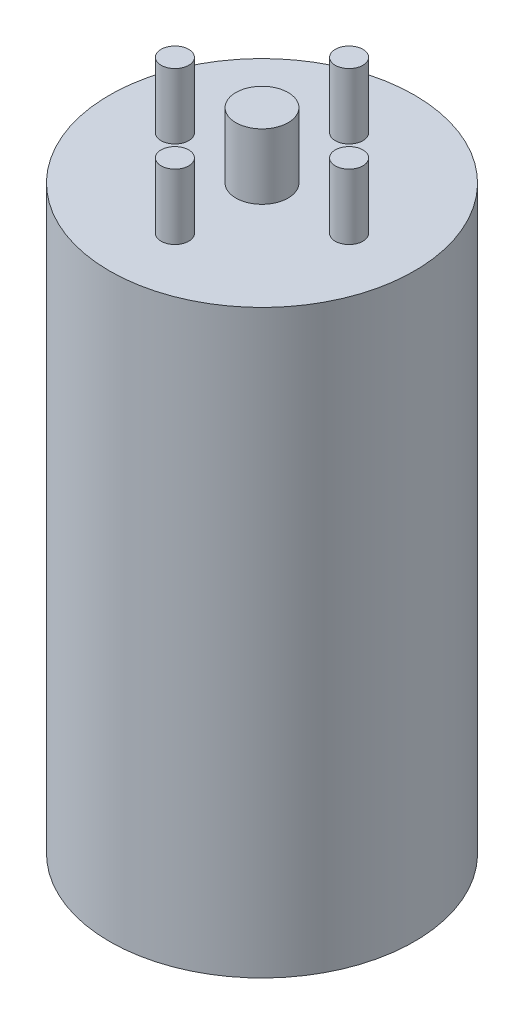
ISO-10303-21;
HEADER;
FILE_DESCRIPTION(('STEP AP214'),'2;1');
FILE_NAME('part.step','',(''),(''),'','','');
FILE_SCHEMA(('AUTOMOTIVE_DESIGN { 1 0 10303 214 1 1 1 1 }'));
ENDSEC;
DATA;
#1=APPLICATION_CONTEXT('core data for automotive mechanical design processes');
#2=APPLICATION_PROTOCOL_DEFINITION('international standard','automotive_design',2000,#1);
#3=PRODUCT_CONTEXT('',#1,'mechanical');
#4=PRODUCT('Part','Part','',(#3));
#5=PRODUCT_RELATED_PRODUCT_CATEGORY('part','',(#4));
#6=PRODUCT_DEFINITION_FORMATION('','',#4);
#7=PRODUCT_DEFINITION_CONTEXT('part definition',#1,'design');
#8=PRODUCT_DEFINITION('design','',#6,#7);
#9=PRODUCT_DEFINITION_SHAPE('','',#8);
#10=(LENGTH_UNIT() NAMED_UNIT(*) SI_UNIT(.MILLI.,.METRE.));
#11=(NAMED_UNIT(*) PLANE_ANGLE_UNIT() SI_UNIT($,.RADIAN.));
#12=(NAMED_UNIT(*) SI_UNIT($,.STERADIAN.) SOLID_ANGLE_UNIT());
#13=UNCERTAINTY_MEASURE_WITH_UNIT(LENGTH_MEASURE(1.E-05),#10,'distance_accuracy_value','');
#14=(GEOMETRIC_REPRESENTATION_CONTEXT(3) GLOBAL_UNCERTAINTY_ASSIGNED_CONTEXT((#13)) GLOBAL_UNIT_ASSIGNED_CONTEXT((#10,
#11,#12)) REPRESENTATION_CONTEXT('',''));
#15=CARTESIAN_POINT('',(0.,0.,0.));
#16=DIRECTION('',(0.,0.,1.));
#17=DIRECTION('',(1.,0.,0.));
#18=AXIS2_PLACEMENT_3D('',#15,#16,#17);
#19=CARTESIAN_POINT('',(0.,53.34,0.));
#20=DIRECTION('',(0.,-1.,0.));
#21=DIRECTION('',(0.,0.,-1.));
#22=AXIS2_PLACEMENT_3D('',#19,#20,#21);
#23=CYLINDRICAL_SURFACE('',#22,14.);
#24=CARTESIAN_POINT('',(0.,53.34,0.));
#25=DIRECTION('',(0.,1.,0.));
#26=DIRECTION('',(0.,0.,1.));
#27=AXIS2_PLACEMENT_3D('',#24,#25,#26);
#28=CIRCLE('',#27,14.);
#29=CARTESIAN_POINT('',(0.,53.34,14.));
#30=VERTEX_POINT('',#29);
#31=EDGE_CURVE('E44',#30,#30,#28,.T.);
#32=ORIENTED_EDGE('',*,*,#31,.F.);
#33=EDGE_LOOP('',(#32));
#34=FACE_BOUND('',#33,.T.);
#35=CARTESIAN_POINT('',(0.,0.,0.));
#36=DIRECTION('',(0.,1.,0.));
#37=DIRECTION('',(0.,0.,1.));
#38=AXIS2_PLACEMENT_3D('',#35,#36,#37);
#39=CIRCLE('',#38,14.);
#40=CARTESIAN_POINT('',(0.,0.,14.));
#41=VERTEX_POINT('',#40);
#42=EDGE_CURVE('E40',#41,#41,#39,.T.);
#43=ORIENTED_EDGE('',*,*,#42,.T.);
#44=EDGE_LOOP('',(#43));
#45=FACE_BOUND('',#44,.T.);
#46=ADVANCED_FACE('F37',(#34,#45),#23,.T.);
#47=CARTESIAN_POINT('',(0.,53.34,0.));
#48=DIRECTION('',(0.,1.,0.));
#49=DIRECTION('',(0.,0.,1.));
#50=AXIS2_PLACEMENT_3D('',#47,#48,#49);
#51=PLANE('',#50);
#52=CARTESIAN_POINT('',(0.,53.34,-8.));
#53=DIRECTION('',(0.,1.,0.));
#54=DIRECTION('',(0.,0.,1.));
#55=AXIS2_PLACEMENT_3D('',#52,#53,#54);
#56=CIRCLE('',#55,1.27);
#57=CARTESIAN_POINT('',(0.,53.34,-6.73));
#58=VERTEX_POINT('',#57);
#59=EDGE_CURVE('E69',#58,#58,#56,.T.);
#60=ORIENTED_EDGE('',*,*,#59,.F.);
#61=EDGE_LOOP('',(#60));
#62=FACE_BOUND('',#61,.T.);
#63=CARTESIAN_POINT('',(-8.,53.34,0.));
#64=DIRECTION('',(0.,1.,0.));
#65=DIRECTION('',(0.,0.,1.));
#66=AXIS2_PLACEMENT_3D('',#63,#64,#65);
#67=CIRCLE('',#66,1.27);
#68=CARTESIAN_POINT('',(-8.,53.34,1.26999999999994));
#69=VERTEX_POINT('',#68);
#70=EDGE_CURVE('E63',#69,#69,#67,.T.);
#71=ORIENTED_EDGE('',*,*,#70,.F.);
#72=EDGE_LOOP('',(#71));
#73=FACE_BOUND('',#72,.T.);
#74=CARTESIAN_POINT('',(0.,53.34,8.));
#75=DIRECTION('',(0.,1.,0.));
#76=DIRECTION('',(0.,0.,1.));
#77=AXIS2_PLACEMENT_3D('',#74,#75,#76);
#78=CIRCLE('',#77,1.27);
#79=CARTESIAN_POINT('',(0.,53.34,9.27));
#80=VERTEX_POINT('',#79);
#81=EDGE_CURVE('E57',#80,#80,#78,.T.);
#82=ORIENTED_EDGE('',*,*,#81,.F.);
#83=EDGE_LOOP('',(#82));
#84=FACE_BOUND('',#83,.T.);
#85=CARTESIAN_POINT('',(8.,53.34,0.));
#86=DIRECTION('',(0.,1.,0.));
#87=DIRECTION('',(0.,0.,1.));
#88=AXIS2_PLACEMENT_3D('',#85,#86,#87);
#89=CIRCLE('',#88,1.27);
#90=CARTESIAN_POINT('',(8.,53.34,1.27));
#91=VERTEX_POINT('',#90);
#92=EDGE_CURVE('E53',#91,#91,#89,.T.);
#93=ORIENTED_EDGE('',*,*,#92,.F.);
#94=EDGE_LOOP('',(#93));
#95=FACE_BOUND('',#94,.T.);
#96=CARTESIAN_POINT('',(0.,53.34,0.));
#97=DIRECTION('',(0.,1.,0.));
#98=DIRECTION('',(0.,0.,1.));
#99=AXIS2_PLACEMENT_3D('',#96,#97,#98);
#100=CIRCLE('',#99,2.4);
#101=CARTESIAN_POINT('',(0.,53.34,2.4));
#102=VERTEX_POINT('',#101);
#103=EDGE_CURVE('E10',#102,#102,#100,.T.);
#104=ORIENTED_EDGE('',*,*,#103,.F.);
#105=EDGE_LOOP('',(#104));
#106=FACE_BOUND('',#105,.T.);
#107=ORIENTED_EDGE('',*,*,#31,.T.);
#108=EDGE_LOOP('',(#107));
#109=FACE_BOUND('',#108,.T.);
#110=ADVANCED_FACE('F80',(#62,#73,#84,#95,#106,#109),#51,.T.);
#111=CARTESIAN_POINT('',(0.,0.,0.));
#112=DIRECTION('',(0.,1.,0.));
#113=DIRECTION('',(0.,0.,1.));
#114=AXIS2_PLACEMENT_3D('',#111,#112,#113);
#115=PLANE('',#114);
#116=ORIENTED_EDGE('',*,*,#42,.F.);
#117=EDGE_LOOP('',(#116));
#118=FACE_BOUND('',#117,.T.);
#119=ADVANCED_FACE('F83',(#118),#115,.F.);
#120=CARTESIAN_POINT('',(0.,59.34,0.));
#121=DIRECTION('',(0.,-1.,0.));
#122=DIRECTION('',(0.,0.,-1.));
#123=AXIS2_PLACEMENT_3D('',#120,#121,#122);
#124=CYLINDRICAL_SURFACE('',#123,2.4);
#125=CARTESIAN_POINT('',(0.,59.34,0.));
#126=DIRECTION('',(0.,1.,0.));
#127=DIRECTION('',(0.,0.,1.));
#128=AXIS2_PLACEMENT_3D('',#125,#126,#127);
#129=CIRCLE('',#128,2.4);
#130=CARTESIAN_POINT('',(0.,59.34,2.4));
#131=VERTEX_POINT('',#130);
#132=EDGE_CURVE('E50',#131,#131,#129,.T.);
#133=ORIENTED_EDGE('',*,*,#132,.F.);
#134=EDGE_LOOP('',(#133));
#135=FACE_BOUND('',#134,.T.);
#136=ORIENTED_EDGE('',*,*,#103,.T.);
#137=EDGE_LOOP('',(#136));
#138=FACE_BOUND('',#137,.T.);
#139=ADVANCED_FACE('F100',(#135,#138),#124,.T.);
#140=CARTESIAN_POINT('',(0.,59.34,0.));
#141=DIRECTION('',(0.,1.,0.));
#142=DIRECTION('',(0.,0.,1.));
#143=AXIS2_PLACEMENT_3D('',#140,#141,#142);
#144=PLANE('',#143);
#145=ORIENTED_EDGE('',*,*,#132,.T.);
#146=EDGE_LOOP('',(#145));
#147=FACE_BOUND('',#146,.T.);
#148=ADVANCED_FACE('F104',(#147),#144,.T.);
#149=CARTESIAN_POINT('',(8.,59.34,0.));
#150=DIRECTION('',(0.,-1.,0.));
#151=DIRECTION('',(0.,0.,-1.));
#152=AXIS2_PLACEMENT_3D('',#149,#150,#151);
#153=CYLINDRICAL_SURFACE('',#152,1.27);
#154=CARTESIAN_POINT('',(8.,59.34,0.));
#155=DIRECTION('',(0.,1.,0.));
#156=DIRECTION('',(0.,0.,1.));
#157=AXIS2_PLACEMENT_3D('',#154,#155,#156);
#158=CIRCLE('',#157,1.27);
#159=CARTESIAN_POINT('',(8.,59.34,1.27));
#160=VERTEX_POINT('',#159);
#161=EDGE_CURVE('E54',#160,#160,#158,.T.);
#162=ORIENTED_EDGE('',*,*,#161,.F.);
#163=EDGE_LOOP('',(#162));
#164=FACE_BOUND('',#163,.T.);
#165=ORIENTED_EDGE('',*,*,#92,.T.);
#166=EDGE_LOOP('',(#165));
#167=FACE_BOUND('',#166,.T.);
#168=ADVANCED_FACE('F110',(#164,#167),#153,.T.);
#169=CARTESIAN_POINT('',(8.,59.34,0.));
#170=DIRECTION('',(0.,1.,0.));
#171=DIRECTION('',(0.,0.,1.));
#172=AXIS2_PLACEMENT_3D('',#169,#170,#171);
#173=PLANE('',#172);
#174=ORIENTED_EDGE('',*,*,#161,.T.);
#175=EDGE_LOOP('',(#174));
#176=FACE_BOUND('',#175,.T.);
#177=ADVANCED_FACE('F112',(#176),#173,.T.);
#178=CARTESIAN_POINT('',(0.,59.34,8.));
#179=DIRECTION('',(0.,-1.,0.));
#180=DIRECTION('',(0.,0.,-1.));
#181=AXIS2_PLACEMENT_3D('',#178,#179,#180);
#182=CYLINDRICAL_SURFACE('',#181,1.27);
#183=CARTESIAN_POINT('',(0.,59.34,8.));
#184=DIRECTION('',(0.,1.,0.));
#185=DIRECTION('',(0.,0.,1.));
#186=AXIS2_PLACEMENT_3D('',#183,#184,#185);
#187=CIRCLE('',#186,1.27);
#188=CARTESIAN_POINT('',(0.,59.34,9.27));
#189=VERTEX_POINT('',#188);
#190=EDGE_CURVE('E60',#189,#189,#187,.T.);
#191=ORIENTED_EDGE('',*,*,#190,.F.);
#192=EDGE_LOOP('',(#191));
#193=FACE_BOUND('',#192,.T.);
#194=ORIENTED_EDGE('',*,*,#81,.T.);
#195=EDGE_LOOP('',(#194));
#196=FACE_BOUND('',#195,.T.);
#197=ADVANCED_FACE('F115',(#193,#196),#182,.T.);
#198=CARTESIAN_POINT('',(0.,59.34,8.));
#199=DIRECTION('',(0.,1.,0.));
#200=DIRECTION('',(0.,0.,1.));
#201=AXIS2_PLACEMENT_3D('',#198,#199,#200);
#202=PLANE('',#201);
#203=ORIENTED_EDGE('',*,*,#190,.T.);
#204=EDGE_LOOP('',(#203));
#205=FACE_BOUND('',#204,.T.);
#206=ADVANCED_FACE('F120',(#205),#202,.T.);
#207=CARTESIAN_POINT('',(-8.,59.34,0.));
#208=DIRECTION('',(0.,-1.,0.));
#209=DIRECTION('',(0.,0.,-1.));
#210=AXIS2_PLACEMENT_3D('',#207,#208,#209);
#211=CYLINDRICAL_SURFACE('',#210,1.27);
#212=CARTESIAN_POINT('',(-8.,59.34,0.));
#213=DIRECTION('',(0.,1.,0.));
#214=DIRECTION('',(0.,0.,1.));
#215=AXIS2_PLACEMENT_3D('',#212,#213,#214);
#216=CIRCLE('',#215,1.27);
#217=CARTESIAN_POINT('',(-8.,59.34,1.26999999999994));
#218=VERTEX_POINT('',#217);
#219=EDGE_CURVE('E66',#218,#218,#216,.T.);
#220=ORIENTED_EDGE('',*,*,#219,.F.);
#221=EDGE_LOOP('',(#220));
#222=FACE_BOUND('',#221,.T.);
#223=ORIENTED_EDGE('',*,*,#70,.T.);
#224=EDGE_LOOP('',(#223));
#225=FACE_BOUND('',#224,.T.);
#226=ADVANCED_FACE('F123',(#222,#225),#211,.T.);
#227=CARTESIAN_POINT('',(-8.,59.34,0.));
#228=DIRECTION('',(0.,1.,0.));
#229=DIRECTION('',(0.,0.,1.));
#230=AXIS2_PLACEMENT_3D('',#227,#228,#229);
#231=PLANE('',#230);
#232=ORIENTED_EDGE('',*,*,#219,.T.);
#233=EDGE_LOOP('',(#232));
#234=FACE_BOUND('',#233,.T.);
#235=ADVANCED_FACE('F128',(#234),#231,.T.);
#236=CARTESIAN_POINT('',(0.,59.34,-8.));
#237=DIRECTION('',(0.,-1.,0.));
#238=DIRECTION('',(0.,0.,-1.));
#239=AXIS2_PLACEMENT_3D('',#236,#237,#238);
#240=CYLINDRICAL_SURFACE('',#239,1.27);
#241=CARTESIAN_POINT('',(0.,59.34,-8.));
#242=DIRECTION('',(0.,1.,0.));
#243=DIRECTION('',(0.,0.,1.));
#244=AXIS2_PLACEMENT_3D('',#241,#242,#243);
#245=CIRCLE('',#244,1.27);
#246=CARTESIAN_POINT('',(0.,59.34,-6.73));
#247=VERTEX_POINT('',#246);
#248=EDGE_CURVE('E72',#247,#247,#245,.T.);
#249=ORIENTED_EDGE('',*,*,#248,.F.);
#250=EDGE_LOOP('',(#249));
#251=FACE_BOUND('',#250,.T.);
#252=ORIENTED_EDGE('',*,*,#59,.T.);
#253=EDGE_LOOP('',(#252));
#254=FACE_BOUND('',#253,.T.);
#255=ADVANCED_FACE('F78',(#251,#254),#240,.T.);
#256=CARTESIAN_POINT('',(0.,59.34,-8.));
#257=DIRECTION('',(0.,1.,0.));
#258=DIRECTION('',(0.,0.,1.));
#259=AXIS2_PLACEMENT_3D('',#256,#257,#258);
#260=PLANE('',#259);
#261=ORIENTED_EDGE('',*,*,#248,.T.);
#262=EDGE_LOOP('',(#261));
#263=FACE_BOUND('',#262,.T.);
#264=ADVANCED_FACE('F135',(#263),#260,.T.);
#265=CLOSED_SHELL('',(#46,#110,#119,#139,#148,#168,#177,#197,#206,#226,#235,#255,#264));
#266=MANIFOLD_SOLID_BREP('B2',#265);
#267=ADVANCED_BREP_SHAPE_REPRESENTATION('',(#18,#266),#14);
#268=SHAPE_DEFINITION_REPRESENTATION(#9,#267);
ENDSEC;
END-ISO-10303-21;
